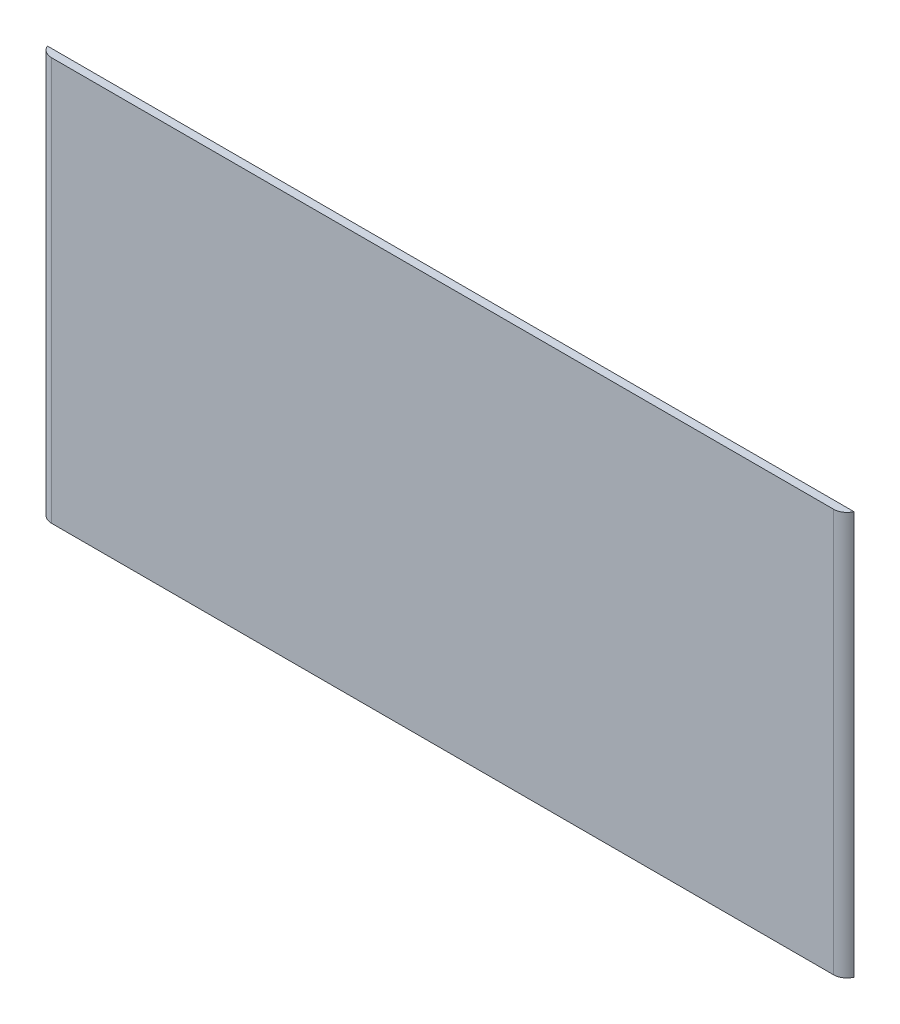
ISO-10303-21;
HEADER;
FILE_DESCRIPTION(('STEP AP214'),'2;1');
FILE_NAME('part.step','',(''),(''),'','','');
FILE_SCHEMA(('AUTOMOTIVE_DESIGN { 1 0 10303 214 1 1 1 1 }'));
ENDSEC;
DATA;
#1=APPLICATION_CONTEXT('core data for automotive mechanical design processes');
#2=APPLICATION_PROTOCOL_DEFINITION('international standard','automotive_design',2000,#1);
#3=PRODUCT_CONTEXT('',#1,'mechanical');
#4=PRODUCT('Part','Part','',(#3));
#5=PRODUCT_RELATED_PRODUCT_CATEGORY('part','',(#4));
#6=PRODUCT_DEFINITION_FORMATION('','',#4);
#7=PRODUCT_DEFINITION_CONTEXT('part definition',#1,'design');
#8=PRODUCT_DEFINITION('design','',#6,#7);
#9=PRODUCT_DEFINITION_SHAPE('','',#8);
#10=(LENGTH_UNIT() NAMED_UNIT(*) SI_UNIT(.MILLI.,.METRE.));
#11=(NAMED_UNIT(*) PLANE_ANGLE_UNIT() SI_UNIT($,.RADIAN.));
#12=(NAMED_UNIT(*) SI_UNIT($,.STERADIAN.) SOLID_ANGLE_UNIT());
#13=UNCERTAINTY_MEASURE_WITH_UNIT(LENGTH_MEASURE(1.E-05),#10,'distance_accuracy_value','');
#14=(GEOMETRIC_REPRESENTATION_CONTEXT(3) GLOBAL_UNCERTAINTY_ASSIGNED_CONTEXT((#13)) GLOBAL_UNIT_ASSIGNED_CONTEXT((#10,
#11,#12)) REPRESENTATION_CONTEXT('',''));
#15=CARTESIAN_POINT('',(0.,0.,0.));
#16=DIRECTION('',(0.,0.,1.));
#17=DIRECTION('',(1.,0.,0.));
#18=AXIS2_PLACEMENT_3D('',#15,#16,#17);
#19=CARTESIAN_POINT('',(0.,-300.,6.));
#20=DIRECTION('',(0.,1.,0.));
#21=DIRECTION('',(0.,0.,1.));
#22=AXIS2_PLACEMENT_3D('',#19,#20,#21);
#23=PLANE('',#22);
#24=DIRECTION('',(1.,0.,0.));
#25=VECTOR('',#24,1.);
#26=CARTESIAN_POINT('',(0.,-300.,6.));
#27=LINE('',#26,#25);
#28=CARTESIAN_POINT('',(9.16515138991172,-300.,6.));
#29=VERTEX_POINT('',#28);
#30=CARTESIAN_POINT('',(590.834848610088,-300.,6.));
#31=VERTEX_POINT('',#30);
#32=EDGE_CURVE('E85',#29,#31,#27,.T.);
#33=ORIENTED_EDGE('',*,*,#32,.F.);
#34=CARTESIAN_POINT('',(9.16515138991172,-300.,-4.));
#35=DIRECTION('',(0.,1.,0.));
#36=DIRECTION('',(0.,0.,1.));
#37=AXIS2_PLACEMENT_3D('',#34,#35,#36);
#38=CIRCLE('',#37,10.);
#39=CARTESIAN_POINT('',(0.,-300.,0.));
#40=VERTEX_POINT('',#39);
#41=EDGE_CURVE('E50',#29,#40,#38,.F.);
#42=ORIENTED_EDGE('',*,*,#41,.T.);
#43=DIRECTION('',(1.,0.,0.));
#44=VECTOR('',#43,1.);
#45=CARTESIAN_POINT('',(0.,-300.,0.));
#46=LINE('',#45,#44);
#47=CARTESIAN_POINT('',(600.,-300.,0.));
#48=VERTEX_POINT('',#47);
#49=EDGE_CURVE('E83',#40,#48,#46,.T.);
#50=ORIENTED_EDGE('',*,*,#49,.T.);
#51=CARTESIAN_POINT('',(590.834848610088,-300.,-4.));
#52=DIRECTION('',(0.,1.,0.));
#53=DIRECTION('',(0.,0.,1.));
#54=AXIS2_PLACEMENT_3D('',#51,#52,#53);
#55=CIRCLE('',#54,10.);
#56=EDGE_CURVE('E109',#48,#31,#55,.F.);
#57=ORIENTED_EDGE('',*,*,#56,.T.);
#58=EDGE_LOOP('',(#33,#42,#50,#57));
#59=FACE_BOUND('',#58,.T.);
#60=ADVANCED_FACE('F42',(#59),#23,.F.);
#61=CARTESIAN_POINT('',(0.,0.,6.));
#62=DIRECTION('',(0.,-1.,0.));
#63=DIRECTION('',(0.,0.,-1.));
#64=AXIS2_PLACEMENT_3D('',#61,#62,#63);
#65=PLANE('',#64);
#66=DIRECTION('',(-1.,0.,0.));
#67=VECTOR('',#66,1.);
#68=CARTESIAN_POINT('',(0.,0.,0.));
#69=LINE('',#68,#67);
#70=CARTESIAN_POINT('',(600.,0.,0.));
#71=VERTEX_POINT('',#70);
#72=CARTESIAN_POINT('',(0.,0.,0.));
#73=VERTEX_POINT('',#72);
#74=EDGE_CURVE('E102',#71,#73,#69,.T.);
#75=ORIENTED_EDGE('',*,*,#74,.T.);
#76=CARTESIAN_POINT('',(9.16515138991168,0.,-4.));
#77=DIRECTION('',(0.,-1.,0.));
#78=DIRECTION('',(0.,0.,-1.));
#79=AXIS2_PLACEMENT_3D('',#76,#77,#78);
#80=CIRCLE('',#79,10.);
#81=CARTESIAN_POINT('',(9.16515138991168,0.,6.));
#82=VERTEX_POINT('',#81);
#83=EDGE_CURVE('E11',#73,#82,#80,.F.);
#84=ORIENTED_EDGE('',*,*,#83,.T.);
#85=DIRECTION('',(-1.,0.,0.));
#86=VECTOR('',#85,1.);
#87=CARTESIAN_POINT('',(0.,0.,6.));
#88=LINE('',#87,#86);
#89=CARTESIAN_POINT('',(590.834848610088,0.,6.));
#90=VERTEX_POINT('',#89);
#91=EDGE_CURVE('E98',#90,#82,#88,.T.);
#92=ORIENTED_EDGE('',*,*,#91,.F.);
#93=CARTESIAN_POINT('',(590.834848610088,0.,-4.));
#94=DIRECTION('',(0.,-1.,0.));
#95=DIRECTION('',(0.,0.,-1.));
#96=AXIS2_PLACEMENT_3D('',#93,#94,#95);
#97=CIRCLE('',#96,10.);
#98=EDGE_CURVE('E107',#90,#71,#97,.F.);
#99=ORIENTED_EDGE('',*,*,#98,.T.);
#100=EDGE_LOOP('',(#75,#84,#92,#99));
#101=FACE_BOUND('',#100,.T.);
#102=ADVANCED_FACE('F114',(#101),#65,.F.);
#103=CARTESIAN_POINT('',(0.,0.,6.));
#104=DIRECTION('',(0.,0.,1.));
#105=DIRECTION('',(1.,0.,0.));
#106=AXIS2_PLACEMENT_3D('',#103,#104,#105);
#107=PLANE('',#106);
#108=ORIENTED_EDGE('',*,*,#91,.T.);
#109=DIRECTION('',(0.,1.,0.));
#110=VECTOR('',#109,1.);
#111=CARTESIAN_POINT('',(9.16515138991172,-300.,6.));
#112=LINE('',#111,#110);
#113=EDGE_CURVE('E86',#82,#29,#112,.F.);
#114=ORIENTED_EDGE('',*,*,#113,.T.);
#115=ORIENTED_EDGE('',*,*,#32,.T.);
#116=DIRECTION('',(0.,-1.,0.));
#117=VECTOR('',#116,1.);
#118=CARTESIAN_POINT('',(590.834848610088,0.,6.));
#119=LINE('',#118,#117);
#120=EDGE_CURVE('E104',#31,#90,#119,.F.);
#121=ORIENTED_EDGE('',*,*,#120,.T.);
#122=EDGE_LOOP('',(#108,#114,#115,#121));
#123=FACE_BOUND('',#122,.T.);
#124=ADVANCED_FACE('F112',(#123),#107,.T.);
#125=CARTESIAN_POINT('',(0.,0.,0.));
#126=DIRECTION('',(0.,0.,1.));
#127=DIRECTION('',(1.,0.,0.));
#128=AXIS2_PLACEMENT_3D('',#125,#126,#127);
#129=PLANE('',#128);
#130=DIRECTION('',(0.,-1.,0.));
#131=VECTOR('',#130,1.);
#132=CARTESIAN_POINT('',(0.,0.,0.));
#133=LINE('',#132,#131);
#134=EDGE_CURVE('E91',#73,#40,#133,.T.);
#135=ORIENTED_EDGE('',*,*,#134,.F.);
#136=ORIENTED_EDGE('',*,*,#74,.F.);
#137=DIRECTION('',(0.,1.,0.));
#138=VECTOR('',#137,1.);
#139=CARTESIAN_POINT('',(600.,0.,0.));
#140=LINE('',#139,#138);
#141=EDGE_CURVE('E93',#48,#71,#140,.T.);
#142=ORIENTED_EDGE('',*,*,#141,.F.);
#143=ORIENTED_EDGE('',*,*,#49,.F.);
#144=EDGE_LOOP('',(#135,#136,#142,#143));
#145=FACE_BOUND('',#144,.T.);
#146=ADVANCED_FACE('F89',(#145),#129,.F.);
#147=CARTESIAN_POINT('',(590.834848610088,0.,-4.));
#148=DIRECTION('',(0.,1.,0.));
#149=DIRECTION('',(0.,0.,1.));
#150=AXIS2_PLACEMENT_3D('',#147,#148,#149);
#151=CYLINDRICAL_SURFACE('',#150,10.);
#152=ORIENTED_EDGE('',*,*,#56,.F.);
#153=ORIENTED_EDGE('',*,*,#141,.T.);
#154=ORIENTED_EDGE('',*,*,#98,.F.);
#155=ORIENTED_EDGE('',*,*,#120,.F.);
#156=EDGE_LOOP('',(#152,#153,#154,#155));
#157=FACE_BOUND('',#156,.T.);
#158=ADVANCED_FACE('F116',(#157),#151,.T.);
#159=CARTESIAN_POINT('',(9.16515138991168,0.,-4.));
#160=DIRECTION('',(0.,-1.,0.));
#161=DIRECTION('',(1.,0.,0.));
#162=AXIS2_PLACEMENT_3D('',#159,#160,#161);
#163=CYLINDRICAL_SURFACE('',#162,10.);
#164=ORIENTED_EDGE('',*,*,#83,.F.);
#165=ORIENTED_EDGE('',*,*,#134,.T.);
#166=ORIENTED_EDGE('',*,*,#41,.F.);
#167=ORIENTED_EDGE('',*,*,#113,.F.);
#168=EDGE_LOOP('',(#164,#165,#166,#167));
#169=FACE_BOUND('',#168,.T.);
#170=ADVANCED_FACE('F44',(#169),#163,.T.);
#171=CLOSED_SHELL('',(#60,#102,#124,#146,#158,#170));
#172=MANIFOLD_SOLID_BREP('B2',#171);
#173=ADVANCED_BREP_SHAPE_REPRESENTATION('',(#18,#172),#14);
#174=SHAPE_DEFINITION_REPRESENTATION(#9,#173);
ENDSEC;
END-ISO-10303-21;
